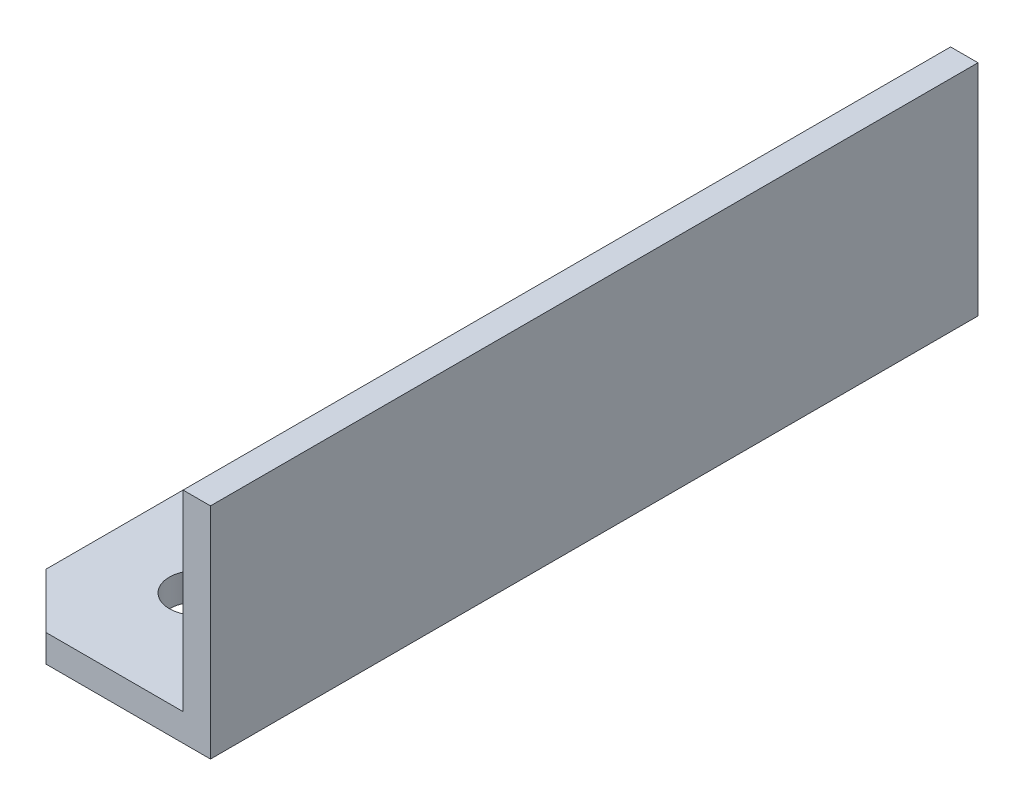
ISO-10303-21;
HEADER;
FILE_DESCRIPTION(('STEP AP214'),'2;1');
FILE_NAME('part.step','',(''),(''),'','','');
FILE_SCHEMA(('AUTOMOTIVE_DESIGN { 1 0 10303 214 1 1 1 1 }'));
ENDSEC;
DATA;
#1=APPLICATION_CONTEXT('core data for automotive mechanical design processes');
#2=APPLICATION_PROTOCOL_DEFINITION('international standard','automotive_design',2000,#1);
#3=PRODUCT_CONTEXT('',#1,'mechanical');
#4=PRODUCT('Part','Part','',(#3));
#5=PRODUCT_RELATED_PRODUCT_CATEGORY('part','',(#4));
#6=PRODUCT_DEFINITION_FORMATION('','',#4);
#7=PRODUCT_DEFINITION_CONTEXT('part definition',#1,'design');
#8=PRODUCT_DEFINITION('design','',#6,#7);
#9=PRODUCT_DEFINITION_SHAPE('','',#8);
#10=(LENGTH_UNIT() NAMED_UNIT(*) SI_UNIT(.MILLI.,.METRE.));
#11=(NAMED_UNIT(*) PLANE_ANGLE_UNIT() SI_UNIT($,.RADIAN.));
#12=(NAMED_UNIT(*) SI_UNIT($,.STERADIAN.) SOLID_ANGLE_UNIT());
#13=UNCERTAINTY_MEASURE_WITH_UNIT(LENGTH_MEASURE(1.E-05),#10,'distance_accuracy_value','');
#14=(GEOMETRIC_REPRESENTATION_CONTEXT(3) GLOBAL_UNCERTAINTY_ASSIGNED_CONTEXT((#13)) GLOBAL_UNIT_ASSIGNED_CONTEXT((#10,
#11,#12)) REPRESENTATION_CONTEXT('',''));
#15=CARTESIAN_POINT('',(0.,0.,0.));
#16=DIRECTION('',(0.,0.,1.));
#17=DIRECTION('',(1.,0.,0.));
#18=AXIS2_PLACEMENT_3D('',#15,#16,#17);
#19=CARTESIAN_POINT('',(0.,0.,-70.));
#20=DIRECTION('',(1.,0.,0.));
#21=DIRECTION('',(0.,0.,-1.));
#22=AXIS2_PLACEMENT_3D('',#19,#20,#21);
#23=PLANE('',#22);
#24=DIRECTION('',(0.,0.,1.));
#25=VECTOR('',#24,1.);
#26=CARTESIAN_POINT('',(0.,40.,-70.));
#27=LINE('',#26,#25);
#28=CARTESIAN_POINT('',(0.,40.,-70.));
#29=VERTEX_POINT('',#28);
#30=CARTESIAN_POINT('',(0.,40.,70.));
#31=VERTEX_POINT('',#30);
#32=EDGE_CURVE('E99',#29,#31,#27,.T.);
#33=ORIENTED_EDGE('',*,*,#32,.T.);
#34=DIRECTION('',(0.,1.,0.));
#35=VECTOR('',#34,1.);
#36=CARTESIAN_POINT('',(0.,0.,70.));
#37=LINE('',#36,#35);
#38=CARTESIAN_POINT('',(0.,0.,70.));
#39=VERTEX_POINT('',#38);
#40=EDGE_CURVE('E102',#39,#31,#37,.T.);
#41=ORIENTED_EDGE('',*,*,#40,.F.);
#42=DIRECTION('',(0.,0.,1.));
#43=VECTOR('',#42,1.);
#44=CARTESIAN_POINT('',(0.,0.,-70.));
#45=LINE('',#44,#43);
#46=CARTESIAN_POINT('',(0.,0.,-70.));
#47=VERTEX_POINT('',#46);
#48=EDGE_CURVE('E138',#47,#39,#45,.T.);
#49=ORIENTED_EDGE('',*,*,#48,.F.);
#50=DIRECTION('',(0.,1.,0.));
#51=VECTOR('',#50,1.);
#52=CARTESIAN_POINT('',(0.,0.,-70.));
#53=LINE('',#52,#51);
#54=EDGE_CURVE('E104',#47,#29,#53,.T.);
#55=ORIENTED_EDGE('',*,*,#54,.T.);
#56=EDGE_LOOP('',(#33,#41,#49,#55));
#57=FACE_BOUND('',#56,.T.);
#58=ADVANCED_FACE('F33',(#57),#23,.T.);
#59=CARTESIAN_POINT('',(-40.,0.,-70.));
#60=DIRECTION('',(0.,-1.,0.));
#61=DIRECTION('',(0.,0.,-1.));
#62=AXIS2_PLACEMENT_3D('',#59,#60,#61);
#63=PLANE('',#62);
#64=CARTESIAN_POINT('',(-22.5,0.,-50.));
#65=DIRECTION('',(0.,-1.,0.));
#66=DIRECTION('',(0.,0.,-1.));
#67=AXIS2_PLACEMENT_3D('',#64,#65,#66);
#68=CIRCLE('',#67,5.);
#69=CARTESIAN_POINT('',(-22.5,0.,-55.));
#70=VERTEX_POINT('',#69);
#71=EDGE_CURVE('E118',#70,#70,#68,.T.);
#72=ORIENTED_EDGE('',*,*,#71,.F.);
#73=EDGE_LOOP('',(#72));
#74=FACE_BOUND('',#73,.T.);
#75=CARTESIAN_POINT('',(-22.5,0.,50.));
#76=DIRECTION('',(0.,-1.,0.));
#77=DIRECTION('',(0.,0.,-1.));
#78=AXIS2_PLACEMENT_3D('',#75,#76,#77);
#79=CIRCLE('',#78,5.);
#80=CARTESIAN_POINT('',(-22.5,0.,45.));
#81=VERTEX_POINT('',#80);
#82=EDGE_CURVE('E255',#81,#81,#79,.T.);
#83=ORIENTED_EDGE('',*,*,#82,.F.);
#84=EDGE_LOOP('',(#83));
#85=FACE_BOUND('',#84,.T.);
#86=DIRECTION('',(0.,0.,1.));
#87=VECTOR('',#86,1.);
#88=CARTESIAN_POINT('',(-40.,0.,-70.));
#89=LINE('',#88,#87);
#90=CARTESIAN_POINT('',(-40.,0.,-59.9999999999999));
#91=VERTEX_POINT('',#90);
#92=CARTESIAN_POINT('',(-40.,0.,60.));
#93=VERTEX_POINT('',#92);
#94=EDGE_CURVE('E141',#91,#93,#89,.T.);
#95=ORIENTED_EDGE('',*,*,#94,.F.);
#96=DIRECTION('',(0.707106781186546,0.,-0.707106781186549));
#97=VECTOR('',#96,1.);
#98=CARTESIAN_POINT('',(-35.,0.,-65.));
#99=LINE('',#98,#97);
#100=CARTESIAN_POINT('',(-30.,0.,-70.));
#101=VERTEX_POINT('',#100);
#102=EDGE_CURVE('E41',#91,#101,#99,.T.);
#103=ORIENTED_EDGE('',*,*,#102,.T.);
#104=DIRECTION('',(1.,0.,0.));
#105=VECTOR('',#104,1.);
#106=CARTESIAN_POINT('',(-40.,0.,-70.));
#107=LINE('',#106,#105);
#108=EDGE_CURVE('E109',#101,#47,#107,.T.);
#109=ORIENTED_EDGE('',*,*,#108,.T.);
#110=ORIENTED_EDGE('',*,*,#48,.T.);
#111=DIRECTION('',(1.,0.,0.));
#112=VECTOR('',#111,1.);
#113=CARTESIAN_POINT('',(-40.,0.,70.));
#114=LINE('',#113,#112);
#115=CARTESIAN_POINT('',(-30.,0.,70.));
#116=VERTEX_POINT('',#115);
#117=EDGE_CURVE('E116',#116,#39,#114,.T.);
#118=ORIENTED_EDGE('',*,*,#117,.F.);
#119=DIRECTION('',(0.707106781186549,0.,0.707106781186546));
#120=VECTOR('',#119,1.);
#121=CARTESIAN_POINT('',(-105.,0.,-4.99999999999973));
#122=LINE('',#121,#120);
#123=EDGE_CURVE('E53',#116,#93,#122,.F.);
#124=ORIENTED_EDGE('',*,*,#123,.T.);
#125=EDGE_LOOP('',(#95,#103,#109,#110,#118,#124));
#126=FACE_BOUND('',#125,.T.);
#127=ADVANCED_FACE('F163',(#74,#85,#126),#63,.T.);
#128=CARTESIAN_POINT('',(-40.,0.,-70.));
#129=DIRECTION('',(1.,0.,0.));
#130=DIRECTION('',(0.,0.,-1.));
#131=AXIS2_PLACEMENT_3D('',#128,#129,#130);
#132=PLANE('',#131);
#133=DIRECTION('',(0.,0.,1.));
#134=VECTOR('',#133,1.);
#135=CARTESIAN_POINT('',(-40.,5.,-70.));
#136=LINE('',#135,#134);
#137=CARTESIAN_POINT('',(-40.,5.,-59.9999999999999));
#138=VERTEX_POINT('',#137);
#139=CARTESIAN_POINT('',(-40.,5.,60.));
#140=VERTEX_POINT('',#139);
#141=EDGE_CURVE('E143',#138,#140,#136,.T.);
#142=ORIENTED_EDGE('',*,*,#141,.F.);
#143=DIRECTION('',(0.,-1.,0.));
#144=VECTOR('',#143,1.);
#145=CARTESIAN_POINT('',(-40.,0.,-59.9999999999999));
#146=LINE('',#145,#144);
#147=EDGE_CURVE('E159',#138,#91,#146,.T.);
#148=ORIENTED_EDGE('',*,*,#147,.T.);
#149=ORIENTED_EDGE('',*,*,#94,.T.);
#150=DIRECTION('',(0.,1.,0.));
#151=VECTOR('',#150,1.);
#152=CARTESIAN_POINT('',(-40.,0.,60.));
#153=LINE('',#152,#151);
#154=EDGE_CURVE('E156',#93,#140,#153,.T.);
#155=ORIENTED_EDGE('',*,*,#154,.T.);
#156=EDGE_LOOP('',(#142,#148,#149,#155));
#157=FACE_BOUND('',#156,.T.);
#158=ADVANCED_FACE('F176',(#157),#132,.F.);
#159=CARTESIAN_POINT('',(-40.,5.,-70.));
#160=DIRECTION('',(0.,-1.,0.));
#161=DIRECTION('',(0.,0.,-1.));
#162=AXIS2_PLACEMENT_3D('',#159,#160,#161);
#163=PLANE('',#162);
#164=CARTESIAN_POINT('',(-22.5,5.,-50.));
#165=DIRECTION('',(0.,1.,0.));
#166=DIRECTION('',(0.,0.,1.));
#167=AXIS2_PLACEMENT_3D('',#164,#165,#166);
#168=CIRCLE('',#167,5.);
#169=CARTESIAN_POINT('',(-22.5,5.,-45.));
#170=VERTEX_POINT('',#169);
#171=EDGE_CURVE('E254',#170,#170,#168,.T.);
#172=ORIENTED_EDGE('',*,*,#171,.F.);
#173=EDGE_LOOP('',(#172));
#174=FACE_BOUND('',#173,.T.);
#175=CARTESIAN_POINT('',(-22.5,5.,50.));
#176=DIRECTION('',(0.,1.,0.));
#177=DIRECTION('',(0.,0.,1.));
#178=AXIS2_PLACEMENT_3D('',#175,#176,#177);
#179=CIRCLE('',#178,5.);
#180=CARTESIAN_POINT('',(-22.5,5.,55.));
#181=VERTEX_POINT('',#180);
#182=EDGE_CURVE('E256',#181,#181,#179,.T.);
#183=ORIENTED_EDGE('',*,*,#182,.F.);
#184=EDGE_LOOP('',(#183));
#185=FACE_BOUND('',#184,.T.);
#186=DIRECTION('',(1.,0.,0.));
#187=VECTOR('',#186,1.);
#188=CARTESIAN_POINT('',(-40.,5.,-70.));
#189=LINE('',#188,#187);
#190=CARTESIAN_POINT('',(-30.,5.,-70.));
#191=VERTEX_POINT('',#190);
#192=CARTESIAN_POINT('',(-5.,5.,-70.));
#193=VERTEX_POINT('',#192);
#194=EDGE_CURVE('E135',#191,#193,#189,.T.);
#195=ORIENTED_EDGE('',*,*,#194,.F.);
#196=DIRECTION('',(-0.707106781186546,0.,0.707106781186549));
#197=VECTOR('',#196,1.);
#198=CARTESIAN_POINT('',(-30.,5.,-70.));
#199=LINE('',#198,#197);
#200=EDGE_CURVE('E154',#191,#138,#199,.T.);
#201=ORIENTED_EDGE('',*,*,#200,.T.);
#202=ORIENTED_EDGE('',*,*,#141,.T.);
#203=DIRECTION('',(-0.707106781186549,0.,-0.707106781186546));
#204=VECTOR('',#203,1.);
#205=CARTESIAN_POINT('',(-40.,5.,60.));
#206=LINE('',#205,#204);
#207=CARTESIAN_POINT('',(-30.,5.,70.));
#208=VERTEX_POINT('',#207);
#209=EDGE_CURVE('E152',#140,#208,#206,.F.);
#210=ORIENTED_EDGE('',*,*,#209,.T.);
#211=DIRECTION('',(1.,0.,0.));
#212=VECTOR('',#211,1.);
#213=CARTESIAN_POINT('',(-40.,5.,70.));
#214=LINE('',#213,#212);
#215=CARTESIAN_POINT('',(-5.,5.,70.));
#216=VERTEX_POINT('',#215);
#217=EDGE_CURVE('E124',#208,#216,#214,.T.);
#218=ORIENTED_EDGE('',*,*,#217,.T.);
#219=DIRECTION('',(0.,0.,1.));
#220=VECTOR('',#219,1.);
#221=CARTESIAN_POINT('',(-5.,5.,-70.));
#222=LINE('',#221,#220);
#223=EDGE_CURVE('E146',#193,#216,#222,.T.);
#224=ORIENTED_EDGE('',*,*,#223,.F.);
#225=EDGE_LOOP('',(#195,#201,#202,#210,#218,#224));
#226=FACE_BOUND('',#225,.T.);
#227=ADVANCED_FACE('F173',(#174,#185,#226),#163,.F.);
#228=CARTESIAN_POINT('',(-5.,0.,-70.));
#229=DIRECTION('',(1.,0.,0.));
#230=DIRECTION('',(0.,0.,-1.));
#231=AXIS2_PLACEMENT_3D('',#228,#229,#230);
#232=PLANE('',#231);
#233=ORIENTED_EDGE('',*,*,#223,.T.);
#234=DIRECTION('',(0.,1.,0.));
#235=VECTOR('',#234,1.);
#236=CARTESIAN_POINT('',(-5.,0.,70.));
#237=LINE('',#236,#235);
#238=CARTESIAN_POINT('',(-5.,40.,70.));
#239=VERTEX_POINT('',#238);
#240=EDGE_CURVE('E122',#216,#239,#237,.T.);
#241=ORIENTED_EDGE('',*,*,#240,.T.);
#242=DIRECTION('',(0.,0.,1.));
#243=VECTOR('',#242,1.);
#244=CARTESIAN_POINT('',(-5.,40.,-70.));
#245=LINE('',#244,#243);
#246=CARTESIAN_POINT('',(-5.,40.,-70.));
#247=VERTEX_POINT('',#246);
#248=EDGE_CURVE('E108',#247,#239,#245,.T.);
#249=ORIENTED_EDGE('',*,*,#248,.F.);
#250=DIRECTION('',(0.,1.,0.));
#251=VECTOR('',#250,1.);
#252=CARTESIAN_POINT('',(-5.,0.,-70.));
#253=LINE('',#252,#251);
#254=EDGE_CURVE('E133',#193,#247,#253,.T.);
#255=ORIENTED_EDGE('',*,*,#254,.F.);
#256=EDGE_LOOP('',(#233,#241,#249,#255));
#257=FACE_BOUND('',#256,.T.);
#258=ADVANCED_FACE('F180',(#257),#232,.F.);
#259=CARTESIAN_POINT('',(-5.,40.,-70.));
#260=DIRECTION('',(0.,-1.,0.));
#261=DIRECTION('',(0.,0.,-1.));
#262=AXIS2_PLACEMENT_3D('',#259,#260,#261);
#263=PLANE('',#262);
#264=ORIENTED_EDGE('',*,*,#248,.T.);
#265=DIRECTION('',(1.,0.,0.));
#266=VECTOR('',#265,1.);
#267=CARTESIAN_POINT('',(-5.,40.,70.));
#268=LINE('',#267,#266);
#269=EDGE_CURVE('E114',#239,#31,#268,.T.);
#270=ORIENTED_EDGE('',*,*,#269,.T.);
#271=ORIENTED_EDGE('',*,*,#32,.F.);
#272=DIRECTION('',(1.,0.,0.));
#273=VECTOR('',#272,1.);
#274=CARTESIAN_POINT('',(-5.,40.,-70.));
#275=LINE('',#274,#273);
#276=EDGE_CURVE('E131',#247,#29,#275,.T.);
#277=ORIENTED_EDGE('',*,*,#276,.F.);
#278=EDGE_LOOP('',(#264,#270,#271,#277));
#279=FACE_BOUND('',#278,.T.);
#280=ADVANCED_FACE('F120',(#279),#263,.F.);
#281=CARTESIAN_POINT('',(0.,0.,-70.));
#282=DIRECTION('',(0.,0.,-1.));
#283=DIRECTION('',(-1.,0.,0.));
#284=AXIS2_PLACEMENT_3D('',#281,#282,#283);
#285=PLANE('',#284);
#286=ORIENTED_EDGE('',*,*,#108,.F.);
#287=DIRECTION('',(0.,1.,0.));
#288=VECTOR('',#287,1.);
#289=CARTESIAN_POINT('',(-30.,5.,-70.));
#290=LINE('',#289,#288);
#291=EDGE_CURVE('E140',#101,#191,#290,.T.);
#292=ORIENTED_EDGE('',*,*,#291,.T.);
#293=ORIENTED_EDGE('',*,*,#194,.T.);
#294=ORIENTED_EDGE('',*,*,#254,.T.);
#295=ORIENTED_EDGE('',*,*,#276,.T.);
#296=ORIENTED_EDGE('',*,*,#54,.F.);
#297=EDGE_LOOP('',(#286,#292,#293,#294,#295,#296));
#298=FACE_BOUND('',#297,.T.);
#299=ADVANCED_FACE('F168',(#298),#285,.T.);
#300=CARTESIAN_POINT('',(0.,0.,70.));
#301=DIRECTION('',(0.,0.,-1.));
#302=DIRECTION('',(-1.,0.,0.));
#303=AXIS2_PLACEMENT_3D('',#300,#301,#302);
#304=PLANE('',#303);
#305=ORIENTED_EDGE('',*,*,#217,.F.);
#306=DIRECTION('',(0.,-1.,0.));
#307=VECTOR('',#306,1.);
#308=CARTESIAN_POINT('',(-30.,0.,70.));
#309=LINE('',#308,#307);
#310=EDGE_CURVE('E11',#208,#116,#309,.T.);
#311=ORIENTED_EDGE('',*,*,#310,.T.);
#312=ORIENTED_EDGE('',*,*,#117,.T.);
#313=ORIENTED_EDGE('',*,*,#40,.T.);
#314=ORIENTED_EDGE('',*,*,#269,.F.);
#315=ORIENTED_EDGE('',*,*,#240,.F.);
#316=EDGE_LOOP('',(#305,#311,#312,#313,#314,#315));
#317=FACE_BOUND('',#316,.T.);
#318=ADVANCED_FACE('F112',(#317),#304,.F.);
#319=CARTESIAN_POINT('',(-30.,0.,-70.));
#320=DIRECTION('',(-0.707106781186549,0.,-0.707106781186546));
#321=DIRECTION('',(0.,-1.,0.));
#322=AXIS2_PLACEMENT_3D('',#319,#320,#321);
#323=PLANE('',#322);
#324=ORIENTED_EDGE('',*,*,#102,.F.);
#325=ORIENTED_EDGE('',*,*,#147,.F.);
#326=ORIENTED_EDGE('',*,*,#200,.F.);
#327=ORIENTED_EDGE('',*,*,#291,.F.);
#328=EDGE_LOOP('',(#324,#325,#326,#327));
#329=FACE_BOUND('',#328,.T.);
#330=ADVANCED_FACE('F170',(#329),#323,.T.);
#331=CARTESIAN_POINT('',(-40.,0.,60.));
#332=DIRECTION('',(0.707106781186546,0.,-0.707106781186549));
#333=DIRECTION('',(0.,1.,0.));
#334=AXIS2_PLACEMENT_3D('',#331,#332,#333);
#335=PLANE('',#334);
#336=ORIENTED_EDGE('',*,*,#123,.F.);
#337=ORIENTED_EDGE('',*,*,#310,.F.);
#338=ORIENTED_EDGE('',*,*,#209,.F.);
#339=ORIENTED_EDGE('',*,*,#154,.F.);
#340=EDGE_LOOP('',(#336,#337,#338,#339));
#341=FACE_BOUND('',#340,.T.);
#342=ADVANCED_FACE('F35',(#341),#335,.F.);
#343=CARTESIAN_POINT('',(-22.5,-5.,50.));
#344=DIRECTION('',(0.,1.,0.));
#345=DIRECTION('',(0.,0.,1.));
#346=AXIS2_PLACEMENT_3D('',#343,#344,#345);
#347=CYLINDRICAL_SURFACE('',#346,5.);
#348=ORIENTED_EDGE('',*,*,#82,.T.);
#349=EDGE_LOOP('',(#348));
#350=FACE_BOUND('',#349,.T.);
#351=ORIENTED_EDGE('',*,*,#182,.T.);
#352=EDGE_LOOP('',(#351));
#353=FACE_BOUND('',#352,.T.);
#354=ADVANCED_FACE('F203',(#350,#353),#347,.F.);
#355=CARTESIAN_POINT('',(-22.5,-5.,-50.));
#356=DIRECTION('',(0.,1.,0.));
#357=DIRECTION('',(0.,0.,1.));
#358=AXIS2_PLACEMENT_3D('',#355,#356,#357);
#359=CYLINDRICAL_SURFACE('',#358,5.);
#360=ORIENTED_EDGE('',*,*,#71,.T.);
#361=EDGE_LOOP('',(#360));
#362=FACE_BOUND('',#361,.T.);
#363=ORIENTED_EDGE('',*,*,#171,.T.);
#364=EDGE_LOOP('',(#363));
#365=FACE_BOUND('',#364,.T.);
#366=ADVANCED_FACE('F236',(#362,#365),#359,.F.);
#367=CLOSED_SHELL('',(#58,#127,#158,#227,#258,#280,#299,#318,#330,#342,#354,#366));
#368=MANIFOLD_SOLID_BREP('B2',#367);
#369=ADVANCED_BREP_SHAPE_REPRESENTATION('',(#18,#368),#14);
#370=SHAPE_DEFINITION_REPRESENTATION(#9,#369);
ENDSEC;
END-ISO-10303-21;
